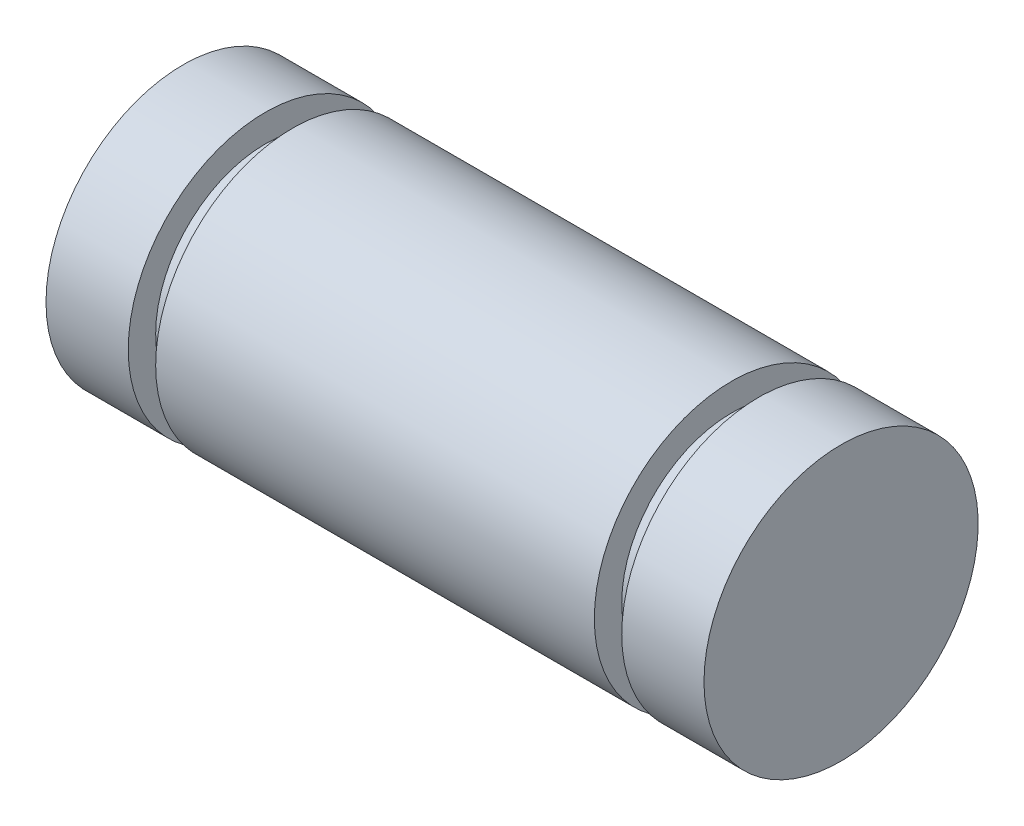
ISO-10303-21;
HEADER;
FILE_DESCRIPTION(('STEP AP214'),'2;1');
FILE_NAME('part.step','',(''),(''),'','','');
FILE_SCHEMA(('AUTOMOTIVE_DESIGN { 1 0 10303 214 1 1 1 1 }'));
ENDSEC;
DATA;
#1=APPLICATION_CONTEXT('core data for automotive mechanical design processes');
#2=APPLICATION_PROTOCOL_DEFINITION('international standard','automotive_design',2000,#1);
#3=PRODUCT_CONTEXT('',#1,'mechanical');
#4=PRODUCT('Part','Part','',(#3));
#5=PRODUCT_RELATED_PRODUCT_CATEGORY('part','',(#4));
#6=PRODUCT_DEFINITION_FORMATION('','',#4);
#7=PRODUCT_DEFINITION_CONTEXT('part definition',#1,'design');
#8=PRODUCT_DEFINITION('design','',#6,#7);
#9=PRODUCT_DEFINITION_SHAPE('','',#8);
#10=(LENGTH_UNIT() NAMED_UNIT(*) SI_UNIT(.MILLI.,.METRE.));
#11=(NAMED_UNIT(*) PLANE_ANGLE_UNIT() SI_UNIT($,.RADIAN.));
#12=(NAMED_UNIT(*) SI_UNIT($,.STERADIAN.) SOLID_ANGLE_UNIT());
#13=UNCERTAINTY_MEASURE_WITH_UNIT(LENGTH_MEASURE(1.E-05),#10,'distance_accuracy_value','');
#14=(GEOMETRIC_REPRESENTATION_CONTEXT(3) GLOBAL_UNCERTAINTY_ASSIGNED_CONTEXT((#13)) GLOBAL_UNIT_ASSIGNED_CONTEXT((#10,
#11,#12)) REPRESENTATION_CONTEXT('',''));
#15=CARTESIAN_POINT('',(0.,0.,0.));
#16=DIRECTION('',(0.,0.,1.));
#17=DIRECTION('',(1.,0.,0.));
#18=AXIS2_PLACEMENT_3D('',#15,#16,#17);
#19=CARTESIAN_POINT('',(0.,2.5,0.));
#20=DIRECTION('',(1.,0.,0.));
#21=DIRECTION('',(0.,0.,-1.));
#22=AXIS2_PLACEMENT_3D('',#19,#20,#21);
#23=PLANE('',#22);
#24=CARTESIAN_POINT('',(0.,0.,0.));
#25=DIRECTION('',(-1.,0.,0.));
#26=DIRECTION('',(0.,0.,1.));
#27=AXIS2_PLACEMENT_3D('',#24,#25,#26);
#28=CIRCLE('',#27,2.5);
#29=CARTESIAN_POINT('',(0.,0.,2.5));
#30=VERTEX_POINT('',#29);
#31=EDGE_CURVE('E80',#30,#30,#28,.T.);
#32=ORIENTED_EDGE('',*,*,#31,.T.);
#33=EDGE_LOOP('',(#32));
#34=FACE_BOUND('',#33,.T.);
#35=ADVANCED_FACE('F37',(#34),#23,.F.);
#36=CARTESIAN_POINT('',(12.,0.,0.));
#37=DIRECTION('',(-1.,0.,0.));
#38=DIRECTION('',(0.,0.,1.));
#39=AXIS2_PLACEMENT_3D('',#36,#37,#38);
#40=PLANE('',#39);
#41=CARTESIAN_POINT('',(12.,0.,0.));
#42=DIRECTION('',(-1.,0.,0.));
#43=DIRECTION('',(0.,0.,1.));
#44=AXIS2_PLACEMENT_3D('',#41,#42,#43);
#45=CIRCLE('',#44,2.5);
#46=CARTESIAN_POINT('',(12.,0.,2.5));
#47=VERTEX_POINT('',#46);
#48=EDGE_CURVE('E10',#47,#47,#45,.T.);
#49=ORIENTED_EDGE('',*,*,#48,.F.);
#50=EDGE_LOOP('',(#49));
#51=FACE_BOUND('',#50,.T.);
#52=ADVANCED_FACE('F135',(#51),#40,.F.);
#53=CARTESIAN_POINT('',(0.,0.,0.));
#54=DIRECTION('',(-1.,0.,0.));
#55=DIRECTION('',(0.,0.,1.));
#56=AXIS2_PLACEMENT_3D('',#53,#54,#55);
#57=CYLINDRICAL_SURFACE('',#56,2.5);
#58=CARTESIAN_POINT('',(10.5,0.,0.));
#59=DIRECTION('',(-1.,0.,0.));
#60=DIRECTION('',(0.,0.,1.));
#61=AXIS2_PLACEMENT_3D('',#58,#59,#60);
#62=CIRCLE('',#61,2.5);
#63=CARTESIAN_POINT('',(10.5,0.,2.5));
#64=VERTEX_POINT('',#63);
#65=EDGE_CURVE('E44',#64,#64,#62,.T.);
#66=ORIENTED_EDGE('',*,*,#65,.F.);
#67=EDGE_LOOP('',(#66));
#68=FACE_BOUND('',#67,.T.);
#69=ORIENTED_EDGE('',*,*,#48,.T.);
#70=EDGE_LOOP('',(#69));
#71=FACE_BOUND('',#70,.T.);
#72=ADVANCED_FACE('F130',(#68,#71),#57,.T.);
#73=CARTESIAN_POINT('',(10.5,2.5,0.));
#74=DIRECTION('',(1.,0.,0.));
#75=DIRECTION('',(0.,0.,-1.));
#76=AXIS2_PLACEMENT_3D('',#73,#74,#75);
#77=PLANE('',#76);
#78=CARTESIAN_POINT('',(10.5,0.,0.));
#79=DIRECTION('',(-1.,0.,0.));
#80=DIRECTION('',(0.,0.,1.));
#81=AXIS2_PLACEMENT_3D('',#78,#79,#80);
#82=CIRCLE('',#81,2.);
#83=CARTESIAN_POINT('',(10.5,0.,2.));
#84=VERTEX_POINT('',#83);
#85=EDGE_CURVE('E49',#84,#84,#82,.T.);
#86=ORIENTED_EDGE('',*,*,#85,.F.);
#87=EDGE_LOOP('',(#86));
#88=FACE_BOUND('',#87,.T.);
#89=ORIENTED_EDGE('',*,*,#65,.T.);
#90=EDGE_LOOP('',(#89));
#91=FACE_BOUND('',#90,.T.);
#92=ADVANCED_FACE('F125',(#88,#91),#77,.F.);
#93=CARTESIAN_POINT('',(0.,0.,0.));
#94=DIRECTION('',(-1.,0.,0.));
#95=DIRECTION('',(0.,0.,1.));
#96=AXIS2_PLACEMENT_3D('',#93,#94,#95);
#97=CYLINDRICAL_SURFACE('',#96,2.);
#98=CARTESIAN_POINT('',(10.,0.,0.));
#99=DIRECTION('',(-1.,0.,0.));
#100=DIRECTION('',(0.,0.,1.));
#101=AXIS2_PLACEMENT_3D('',#98,#99,#100);
#102=CIRCLE('',#101,2.);
#103=CARTESIAN_POINT('',(10.,0.,2.));
#104=VERTEX_POINT('',#103);
#105=EDGE_CURVE('E54',#104,#104,#102,.T.);
#106=ORIENTED_EDGE('',*,*,#105,.F.);
#107=EDGE_LOOP('',(#106));
#108=FACE_BOUND('',#107,.T.);
#109=ORIENTED_EDGE('',*,*,#85,.T.);
#110=EDGE_LOOP('',(#109));
#111=FACE_BOUND('',#110,.T.);
#112=ADVANCED_FACE('F119',(#108,#111),#97,.T.);
#113=CARTESIAN_POINT('',(10.,2.,0.));
#114=DIRECTION('',(-1.,0.,0.));
#115=DIRECTION('',(0.,0.,1.));
#116=AXIS2_PLACEMENT_3D('',#113,#114,#115);
#117=PLANE('',#116);
#118=CARTESIAN_POINT('',(10.,0.,0.));
#119=DIRECTION('',(-1.,0.,0.));
#120=DIRECTION('',(0.,0.,1.));
#121=AXIS2_PLACEMENT_3D('',#118,#119,#120);
#122=CIRCLE('',#121,2.5);
#123=CARTESIAN_POINT('',(10.,0.,2.5));
#124=VERTEX_POINT('',#123);
#125=EDGE_CURVE('E60',#124,#124,#122,.T.);
#126=ORIENTED_EDGE('',*,*,#125,.F.);
#127=EDGE_LOOP('',(#126));
#128=FACE_BOUND('',#127,.T.);
#129=ORIENTED_EDGE('',*,*,#105,.T.);
#130=EDGE_LOOP('',(#129));
#131=FACE_BOUND('',#130,.T.);
#132=ADVANCED_FACE('F113',(#128,#131),#117,.F.);
#133=CARTESIAN_POINT('',(0.,0.,0.));
#134=DIRECTION('',(-1.,0.,0.));
#135=DIRECTION('',(0.,0.,1.));
#136=AXIS2_PLACEMENT_3D('',#133,#134,#135);
#137=CYLINDRICAL_SURFACE('',#136,2.5);
#138=CARTESIAN_POINT('',(2.,0.,0.));
#139=DIRECTION('',(-1.,0.,0.));
#140=DIRECTION('',(0.,0.,1.));
#141=AXIS2_PLACEMENT_3D('',#138,#139,#140);
#142=CIRCLE('',#141,2.5);
#143=CARTESIAN_POINT('',(2.,0.,2.5));
#144=VERTEX_POINT('',#143);
#145=EDGE_CURVE('E64',#144,#144,#142,.T.);
#146=ORIENTED_EDGE('',*,*,#145,.F.);
#147=EDGE_LOOP('',(#146));
#148=FACE_BOUND('',#147,.T.);
#149=ORIENTED_EDGE('',*,*,#125,.T.);
#150=EDGE_LOOP('',(#149));
#151=FACE_BOUND('',#150,.T.);
#152=ADVANCED_FACE('F107',(#148,#151),#137,.T.);
#153=CARTESIAN_POINT('',(2.,2.5,0.));
#154=DIRECTION('',(1.,0.,0.));
#155=DIRECTION('',(0.,0.,-1.));
#156=AXIS2_PLACEMENT_3D('',#153,#154,#155);
#157=PLANE('',#156);
#158=CARTESIAN_POINT('',(2.,0.,0.));
#159=DIRECTION('',(-1.,0.,0.));
#160=DIRECTION('',(0.,0.,1.));
#161=AXIS2_PLACEMENT_3D('',#158,#159,#160);
#162=CIRCLE('',#161,2.);
#163=CARTESIAN_POINT('',(2.,0.,2.));
#164=VERTEX_POINT('',#163);
#165=EDGE_CURVE('E68',#164,#164,#162,.T.);
#166=ORIENTED_EDGE('',*,*,#165,.F.);
#167=EDGE_LOOP('',(#166));
#168=FACE_BOUND('',#167,.T.);
#169=ORIENTED_EDGE('',*,*,#145,.T.);
#170=EDGE_LOOP('',(#169));
#171=FACE_BOUND('',#170,.T.);
#172=ADVANCED_FACE('F101',(#168,#171),#157,.F.);
#173=CARTESIAN_POINT('',(0.,0.,0.));
#174=DIRECTION('',(-1.,0.,0.));
#175=DIRECTION('',(0.,0.,1.));
#176=AXIS2_PLACEMENT_3D('',#173,#174,#175);
#177=CYLINDRICAL_SURFACE('',#176,2.);
#178=CARTESIAN_POINT('',(1.5,0.,0.));
#179=DIRECTION('',(-1.,0.,0.));
#180=DIRECTION('',(0.,0.,1.));
#181=AXIS2_PLACEMENT_3D('',#178,#179,#180);
#182=CIRCLE('',#181,2.);
#183=CARTESIAN_POINT('',(1.5,0.,2.));
#184=VERTEX_POINT('',#183);
#185=EDGE_CURVE('E72',#184,#184,#182,.T.);
#186=ORIENTED_EDGE('',*,*,#185,.F.);
#187=EDGE_LOOP('',(#186));
#188=FACE_BOUND('',#187,.T.);
#189=ORIENTED_EDGE('',*,*,#165,.T.);
#190=EDGE_LOOP('',(#189));
#191=FACE_BOUND('',#190,.T.);
#192=ADVANCED_FACE('F95',(#188,#191),#177,.T.);
#193=CARTESIAN_POINT('',(1.5,2.,0.));
#194=DIRECTION('',(-1.,0.,0.));
#195=DIRECTION('',(0.,0.,1.));
#196=AXIS2_PLACEMENT_3D('',#193,#194,#195);
#197=PLANE('',#196);
#198=CARTESIAN_POINT('',(1.5,0.,0.));
#199=DIRECTION('',(-1.,0.,0.));
#200=DIRECTION('',(0.,0.,1.));
#201=AXIS2_PLACEMENT_3D('',#198,#199,#200);
#202=CIRCLE('',#201,2.5);
#203=CARTESIAN_POINT('',(1.5,0.,2.5));
#204=VERTEX_POINT('',#203);
#205=EDGE_CURVE('E76',#204,#204,#202,.T.);
#206=ORIENTED_EDGE('',*,*,#205,.F.);
#207=EDGE_LOOP('',(#206));
#208=FACE_BOUND('',#207,.T.);
#209=ORIENTED_EDGE('',*,*,#185,.T.);
#210=EDGE_LOOP('',(#209));
#211=FACE_BOUND('',#210,.T.);
#212=ADVANCED_FACE('F89',(#208,#211),#197,.F.);
#213=CARTESIAN_POINT('',(0.,0.,0.));
#214=DIRECTION('',(-1.,0.,0.));
#215=DIRECTION('',(0.,0.,1.));
#216=AXIS2_PLACEMENT_3D('',#213,#214,#215);
#217=CYLINDRICAL_SURFACE('',#216,2.5);
#218=ORIENTED_EDGE('',*,*,#31,.F.);
#219=EDGE_LOOP('',(#218));
#220=FACE_BOUND('',#219,.T.);
#221=ORIENTED_EDGE('',*,*,#205,.T.);
#222=EDGE_LOOP('',(#221));
#223=FACE_BOUND('',#222,.T.);
#224=ADVANCED_FACE('F86',(#220,#223),#217,.T.);
#225=CLOSED_SHELL('',(#35,#52,#72,#92,#112,#132,#152,#172,#192,#212,#224));
#226=MANIFOLD_SOLID_BREP('B2',#225);
#227=ADVANCED_BREP_SHAPE_REPRESENTATION('',(#18,#226),#14);
#228=SHAPE_DEFINITION_REPRESENTATION(#9,#227);
ENDSEC;
END-ISO-10303-21;
